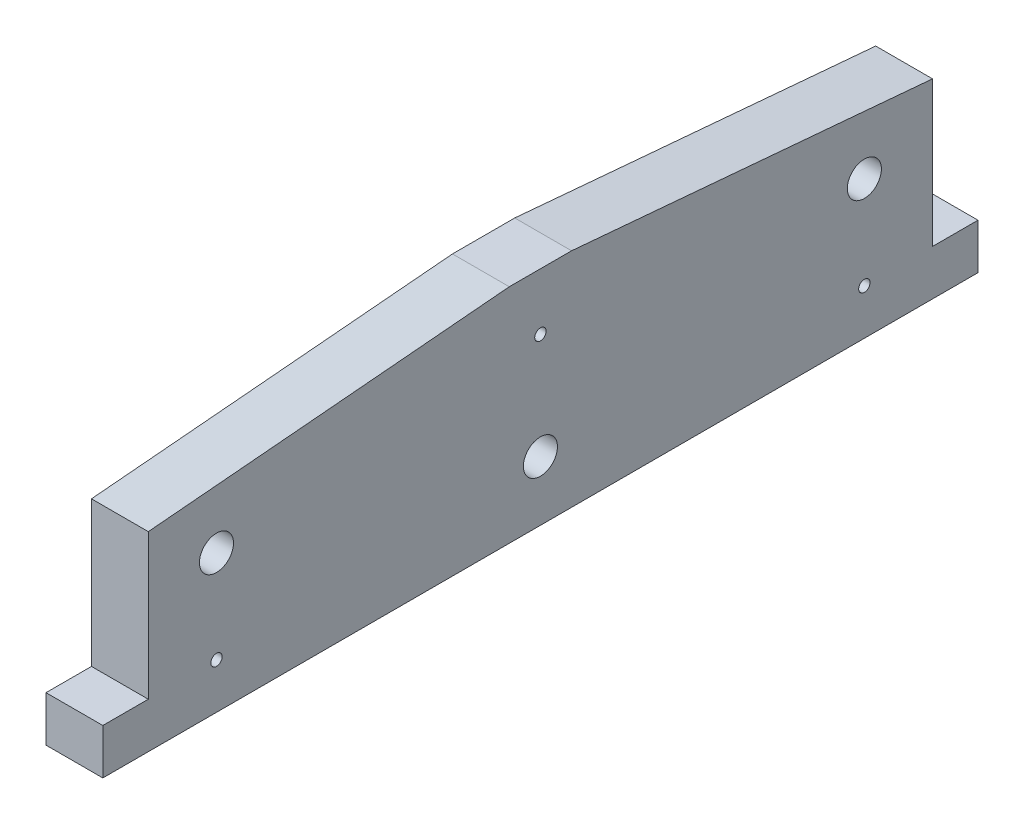
ISO-10303-21;
HEADER;
FILE_DESCRIPTION(('STEP AP214'),'2;1');
FILE_NAME('part.step','',(''),(''),'','','');
FILE_SCHEMA(('AUTOMOTIVE_DESIGN { 1 0 10303 214 1 1 1 1 }'));
ENDSEC;
DATA;
#1=APPLICATION_CONTEXT('core data for automotive mechanical design processes');
#2=APPLICATION_PROTOCOL_DEFINITION('international standard','automotive_design',2000,#1);
#3=PRODUCT_CONTEXT('',#1,'mechanical');
#4=PRODUCT('Part','Part','',(#3));
#5=PRODUCT_RELATED_PRODUCT_CATEGORY('part','',(#4));
#6=PRODUCT_DEFINITION_FORMATION('','',#4);
#7=PRODUCT_DEFINITION_CONTEXT('part definition',#1,'design');
#8=PRODUCT_DEFINITION('design','',#6,#7);
#9=PRODUCT_DEFINITION_SHAPE('','',#8);
#10=(LENGTH_UNIT() NAMED_UNIT(*) SI_UNIT(.MILLI.,.METRE.));
#11=(NAMED_UNIT(*) PLANE_ANGLE_UNIT() SI_UNIT($,.RADIAN.));
#12=(NAMED_UNIT(*) SI_UNIT($,.STERADIAN.) SOLID_ANGLE_UNIT());
#13=UNCERTAINTY_MEASURE_WITH_UNIT(LENGTH_MEASURE(1.E-05),#10,'distance_accuracy_value','');
#14=(GEOMETRIC_REPRESENTATION_CONTEXT(3) GLOBAL_UNCERTAINTY_ASSIGNED_CONTEXT((#13)) GLOBAL_UNIT_ASSIGNED_CONTEXT((#10,
#11,#12)) REPRESENTATION_CONTEXT('',''));
#15=CARTESIAN_POINT('',(0.,0.,0.));
#16=DIRECTION('',(0.,0.,1.));
#17=DIRECTION('',(1.,0.,0.));
#18=AXIS2_PLACEMENT_3D('',#15,#16,#17);
#19=CARTESIAN_POINT('',(10.,-3.94802521709064,-69.5));
#20=DIRECTION('',(0.,0.,1.));
#21=DIRECTION('',(1.,0.,0.));
#22=AXIS2_PLACEMENT_3D('',#19,#20,#21);
#23=PLANE('',#22);
#24=DIRECTION('',(0.,1.,0.));
#25=VECTOR('',#24,1.);
#26=CARTESIAN_POINT('',(0.,-3.94802521709064,-69.5));
#27=LINE('',#26,#25);
#28=CARTESIAN_POINT('',(0.,-29.4898596344228,-69.5));
#29=VERTEX_POINT('',#28);
#30=CARTESIAN_POINT('',(0.,-3.94802521709064,-69.5));
#31=VERTEX_POINT('',#30);
#32=EDGE_CURVE('E143',#29,#31,#27,.T.);
#33=ORIENTED_EDGE('',*,*,#32,.T.);
#34=DIRECTION('',(-1.,0.,0.));
#35=VECTOR('',#34,1.);
#36=CARTESIAN_POINT('',(10.,-3.94802521709064,-69.5));
#37=LINE('',#36,#35);
#38=CARTESIAN_POINT('',(10.,-3.94802521709064,-69.5));
#39=VERTEX_POINT('',#38);
#40=EDGE_CURVE('E11',#39,#31,#37,.T.);
#41=ORIENTED_EDGE('',*,*,#40,.F.);
#42=DIRECTION('',(0.,1.,0.));
#43=VECTOR('',#42,1.);
#44=CARTESIAN_POINT('',(10.,-3.94802521709064,-69.5));
#45=LINE('',#44,#43);
#46=CARTESIAN_POINT('',(10.,-29.4898596344228,-69.5));
#47=VERTEX_POINT('',#46);
#48=EDGE_CURVE('E163',#47,#39,#45,.T.);
#49=ORIENTED_EDGE('',*,*,#48,.F.);
#50=DIRECTION('',(-1.,0.,0.));
#51=VECTOR('',#50,1.);
#52=CARTESIAN_POINT('',(10.,-29.4898596344228,-69.5));
#53=LINE('',#52,#51);
#54=EDGE_CURVE('E139',#47,#29,#53,.T.);
#55=ORIENTED_EDGE('',*,*,#54,.T.);
#56=EDGE_LOOP('',(#33,#41,#49,#55));
#57=FACE_BOUND('',#56,.T.);
#58=ADVANCED_FACE('F35',(#57),#23,.F.);
#59=CARTESIAN_POINT('',(10.,1.60941483557722,-5.97816952854575));
#60=DIRECTION('',(0.,-0.996194698091746,0.0871557427476582));
#61=DIRECTION('',(0.,-0.0871557427476582,-0.996194698091746));
#62=AXIS2_PLACEMENT_3D('',#59,#60,#61);
#63=PLANE('',#62);
#64=DIRECTION('',(0.,0.0871557427476582,0.996194698091745));
#65=VECTOR('',#64,1.);
#66=CARTESIAN_POINT('',(0.,1.60941483557722,-5.97816952854575));
#67=LINE('',#66,#65);
#68=CARTESIAN_POINT('',(0.,1.60941483557722,-5.97816952854575));
#69=VERTEX_POINT('',#68);
#70=EDGE_CURVE('E146',#31,#69,#67,.T.);
#71=ORIENTED_EDGE('',*,*,#70,.T.);
#72=DIRECTION('',(-1.,0.,0.));
#73=VECTOR('',#72,1.);
#74=CARTESIAN_POINT('',(10.,1.60941483557722,-5.97816952854575));
#75=LINE('',#74,#73);
#76=CARTESIAN_POINT('',(10.,1.60941483557722,-5.97816952854575));
#77=VERTEX_POINT('',#76);
#78=EDGE_CURVE('E43',#77,#69,#75,.T.);
#79=ORIENTED_EDGE('',*,*,#78,.F.);
#80=DIRECTION('',(0.,0.0871557427476582,0.996194698091745));
#81=VECTOR('',#80,1.);
#82=CARTESIAN_POINT('',(10.,1.60941483557722,-5.97816952854575));
#83=LINE('',#82,#81);
#84=EDGE_CURVE('E100',#39,#77,#83,.T.);
#85=ORIENTED_EDGE('',*,*,#84,.F.);
#86=ORIENTED_EDGE('',*,*,#40,.T.);
#87=EDGE_LOOP('',(#71,#79,#85,#86));
#88=FACE_BOUND('',#87,.T.);
#89=ADVANCED_FACE('F184',(#88),#63,.F.);
#90=CARTESIAN_POINT('',(10.,1.60941483557722,4.97816952854575));
#91=DIRECTION('',(0.,-1.,0.));
#92=DIRECTION('',(0.,0.,-1.));
#93=AXIS2_PLACEMENT_3D('',#90,#91,#92);
#94=PLANE('',#93);
#95=DIRECTION('',(0.,0.,1.));
#96=VECTOR('',#95,1.);
#97=CARTESIAN_POINT('',(0.,1.60941483557722,4.97816952854575));
#98=LINE('',#97,#96);
#99=CARTESIAN_POINT('',(0.,1.60941483557722,4.97816952854575));
#100=VERTEX_POINT('',#99);
#101=EDGE_CURVE('E150',#69,#100,#98,.T.);
#102=ORIENTED_EDGE('',*,*,#101,.T.);
#103=DIRECTION('',(-1.,0.,0.));
#104=VECTOR('',#103,1.);
#105=CARTESIAN_POINT('',(10.,1.60941483557722,4.97816952854575));
#106=LINE('',#105,#104);
#107=CARTESIAN_POINT('',(10.,1.60941483557722,4.97816952854575));
#108=VERTEX_POINT('',#107);
#109=EDGE_CURVE('E176',#108,#100,#106,.T.);
#110=ORIENTED_EDGE('',*,*,#109,.F.);
#111=DIRECTION('',(0.,0.,1.));
#112=VECTOR('',#111,1.);
#113=CARTESIAN_POINT('',(10.,1.60941483557722,-5.97816952854575));
#114=LINE('',#113,#112);
#115=EDGE_CURVE('E183',#77,#108,#114,.T.);
#116=ORIENTED_EDGE('',*,*,#115,.F.);
#117=ORIENTED_EDGE('',*,*,#78,.T.);
#118=EDGE_LOOP('',(#102,#110,#116,#117));
#119=FACE_BOUND('',#118,.T.);
#120=ADVANCED_FACE('F181',(#119),#94,.F.);
#121=CARTESIAN_POINT('',(10.,1.60941483557722,4.97816952854575));
#122=DIRECTION('',(0.,-0.996194698091746,-0.0871557427476585));
#123=DIRECTION('',(0.,0.0871557427476585,-0.996194698091746));
#124=AXIS2_PLACEMENT_3D('',#121,#122,#123);
#125=PLANE('',#124);
#126=DIRECTION('',(0.,-0.0871557427476584,0.996194698091745));
#127=VECTOR('',#126,1.);
#128=CARTESIAN_POINT('',(0.,1.60941483557722,4.97816952854575));
#129=LINE('',#128,#127);
#130=CARTESIAN_POINT('',(0.,-3.94802521709065,68.5));
#131=VERTEX_POINT('',#130);
#132=EDGE_CURVE('E152',#100,#131,#129,.T.);
#133=ORIENTED_EDGE('',*,*,#132,.T.);
#134=DIRECTION('',(-1.,0.,0.));
#135=VECTOR('',#134,1.);
#136=CARTESIAN_POINT('',(10.,-3.94802521709065,68.5));
#137=LINE('',#136,#135);
#138=CARTESIAN_POINT('',(10.,-3.94802521709065,68.5));
#139=VERTEX_POINT('',#138);
#140=EDGE_CURVE('E173',#139,#131,#137,.T.);
#141=ORIENTED_EDGE('',*,*,#140,.F.);
#142=DIRECTION('',(0.,-0.0871557427476584,0.996194698091745));
#143=VECTOR('',#142,1.);
#144=CARTESIAN_POINT('',(10.,1.60941483557722,4.97816952854575));
#145=LINE('',#144,#143);
#146=EDGE_CURVE('E203',#108,#139,#145,.T.);
#147=ORIENTED_EDGE('',*,*,#146,.F.);
#148=ORIENTED_EDGE('',*,*,#109,.T.);
#149=EDGE_LOOP('',(#133,#141,#147,#148));
#150=FACE_BOUND('',#149,.T.);
#151=ADVANCED_FACE('F194',(#150),#125,.F.);
#152=CARTESIAN_POINT('',(10.,-3.94802521709065,68.5));
#153=DIRECTION('',(0.,0.,-1.));
#154=DIRECTION('',(-1.,0.,0.));
#155=AXIS2_PLACEMENT_3D('',#152,#153,#154);
#156=PLANE('',#155);
#157=DIRECTION('',(0.,-1.,0.));
#158=VECTOR('',#157,1.);
#159=CARTESIAN_POINT('',(0.,-3.94802521709065,68.5));
#160=LINE('',#159,#158);
#161=CARTESIAN_POINT('',(0.,-29.4898596344228,68.5));
#162=VERTEX_POINT('',#161);
#163=EDGE_CURVE('E154',#131,#162,#160,.T.);
#164=ORIENTED_EDGE('',*,*,#163,.T.);
#165=DIRECTION('',(-1.,0.,0.));
#166=VECTOR('',#165,1.);
#167=CARTESIAN_POINT('',(10.,-29.4898596344228,68.5));
#168=LINE('',#167,#166);
#169=CARTESIAN_POINT('',(10.,-29.4898596344228,68.5));
#170=VERTEX_POINT('',#169);
#171=EDGE_CURVE('E170',#170,#162,#168,.T.);
#172=ORIENTED_EDGE('',*,*,#171,.F.);
#173=DIRECTION('',(0.,-1.,0.));
#174=VECTOR('',#173,1.);
#175=CARTESIAN_POINT('',(10.,-3.94802521709065,68.5));
#176=LINE('',#175,#174);
#177=EDGE_CURVE('E200',#139,#170,#176,.T.);
#178=ORIENTED_EDGE('',*,*,#177,.F.);
#179=ORIENTED_EDGE('',*,*,#140,.T.);
#180=EDGE_LOOP('',(#164,#172,#178,#179));
#181=FACE_BOUND('',#180,.T.);
#182=ADVANCED_FACE('F198',(#181),#156,.F.);
#183=CARTESIAN_POINT('',(10.,-29.4898596344228,76.5));
#184=DIRECTION('',(0.,-1.,0.));
#185=DIRECTION('',(0.,0.,-1.));
#186=AXIS2_PLACEMENT_3D('',#183,#184,#185);
#187=PLANE('',#186);
#188=DIRECTION('',(0.,0.,1.));
#189=VECTOR('',#188,1.);
#190=CARTESIAN_POINT('',(0.,-29.4898596344228,76.5));
#191=LINE('',#190,#189);
#192=CARTESIAN_POINT('',(0.,-29.4898596344228,76.5));
#193=VERTEX_POINT('',#192);
#194=EDGE_CURVE('E156',#162,#193,#191,.T.);
#195=ORIENTED_EDGE('',*,*,#194,.T.);
#196=DIRECTION('',(-1.,0.,0.));
#197=VECTOR('',#196,1.);
#198=CARTESIAN_POINT('',(10.,-29.4898596344228,76.5));
#199=LINE('',#198,#197);
#200=CARTESIAN_POINT('',(10.,-29.4898596344228,76.5));
#201=VERTEX_POINT('',#200);
#202=EDGE_CURVE('E167',#201,#193,#199,.T.);
#203=ORIENTED_EDGE('',*,*,#202,.F.);
#204=DIRECTION('',(0.,0.,1.));
#205=VECTOR('',#204,1.);
#206=CARTESIAN_POINT('',(10.,-29.4898596344228,76.5));
#207=LINE('',#206,#205);
#208=EDGE_CURVE('E202',#170,#201,#207,.T.);
#209=ORIENTED_EDGE('',*,*,#208,.F.);
#210=ORIENTED_EDGE('',*,*,#171,.T.);
#211=EDGE_LOOP('',(#195,#203,#209,#210));
#212=FACE_BOUND('',#211,.T.);
#213=ADVANCED_FACE('F295',(#212),#187,.F.);
#214=CARTESIAN_POINT('',(10.,-37.4898596344228,76.5));
#215=DIRECTION('',(0.,0.,-1.));
#216=DIRECTION('',(-1.,0.,0.));
#217=AXIS2_PLACEMENT_3D('',#214,#215,#216);
#218=PLANE('',#217);
#219=DIRECTION('',(0.,-1.,0.));
#220=VECTOR('',#219,1.);
#221=CARTESIAN_POINT('',(0.,-37.4898596344228,76.5));
#222=LINE('',#221,#220);
#223=CARTESIAN_POINT('',(0.,-37.4898596344228,76.5));
#224=VERTEX_POINT('',#223);
#225=EDGE_CURVE('E158',#193,#224,#222,.T.);
#226=ORIENTED_EDGE('',*,*,#225,.T.);
#227=DIRECTION('',(-1.,0.,0.));
#228=VECTOR('',#227,1.);
#229=CARTESIAN_POINT('',(10.,-37.4898596344228,76.5));
#230=LINE('',#229,#228);
#231=CARTESIAN_POINT('',(10.,-37.4898596344228,76.5));
#232=VERTEX_POINT('',#231);
#233=EDGE_CURVE('E134',#232,#224,#230,.T.);
#234=ORIENTED_EDGE('',*,*,#233,.F.);
#235=DIRECTION('',(0.,-1.,0.));
#236=VECTOR('',#235,1.);
#237=CARTESIAN_POINT('',(10.,-37.4898596344228,76.5));
#238=LINE('',#237,#236);
#239=EDGE_CURVE('E125',#201,#232,#238,.T.);
#240=ORIENTED_EDGE('',*,*,#239,.F.);
#241=ORIENTED_EDGE('',*,*,#202,.T.);
#242=EDGE_LOOP('',(#226,#234,#240,#241));
#243=FACE_BOUND('',#242,.T.);
#244=ADVANCED_FACE('F292',(#243),#218,.F.);
#245=CARTESIAN_POINT('',(10.,-37.4898596344227,-77.5));
#246=DIRECTION('',(0.,1.,0.));
#247=DIRECTION('',(0.,0.,1.));
#248=AXIS2_PLACEMENT_3D('',#245,#246,#247);
#249=PLANE('',#248);
#250=DIRECTION('',(0.,0.,-1.));
#251=VECTOR('',#250,1.);
#252=CARTESIAN_POINT('',(0.,-37.4898596344227,-77.5));
#253=LINE('',#252,#251);
#254=CARTESIAN_POINT('',(0.,-37.4898596344227,-77.5));
#255=VERTEX_POINT('',#254);
#256=EDGE_CURVE('E133',#224,#255,#253,.T.);
#257=ORIENTED_EDGE('',*,*,#256,.T.);
#258=DIRECTION('',(-1.,0.,0.));
#259=VECTOR('',#258,1.);
#260=CARTESIAN_POINT('',(10.,-37.4898596344227,-77.5));
#261=LINE('',#260,#259);
#262=CARTESIAN_POINT('',(10.,-37.4898596344227,-77.5));
#263=VERTEX_POINT('',#262);
#264=EDGE_CURVE('E130',#263,#255,#261,.T.);
#265=ORIENTED_EDGE('',*,*,#264,.F.);
#266=DIRECTION('',(0.,0.,-1.));
#267=VECTOR('',#266,1.);
#268=CARTESIAN_POINT('',(10.,-37.4898596344227,-77.5));
#269=LINE('',#268,#267);
#270=EDGE_CURVE('E119',#232,#263,#269,.T.);
#271=ORIENTED_EDGE('',*,*,#270,.F.);
#272=ORIENTED_EDGE('',*,*,#233,.T.);
#273=EDGE_LOOP('',(#257,#265,#271,#272));
#274=FACE_BOUND('',#273,.T.);
#275=ADVANCED_FACE('F131',(#274),#249,.F.);
#276=CARTESIAN_POINT('',(10.,-37.4898596344227,-77.5));
#277=DIRECTION('',(0.,0.,1.));
#278=DIRECTION('',(1.,0.,0.));
#279=AXIS2_PLACEMENT_3D('',#276,#277,#278);
#280=PLANE('',#279);
#281=DIRECTION('',(0.,1.,0.));
#282=VECTOR('',#281,1.);
#283=CARTESIAN_POINT('',(0.,-37.4898596344227,-77.5));
#284=LINE('',#283,#282);
#285=CARTESIAN_POINT('',(0.,-29.4898596344228,-77.5));
#286=VERTEX_POINT('',#285);
#287=EDGE_CURVE('E86',#255,#286,#284,.T.);
#288=ORIENTED_EDGE('',*,*,#287,.T.);
#289=DIRECTION('',(-1.,0.,0.));
#290=VECTOR('',#289,1.);
#291=CARTESIAN_POINT('',(10.,-29.4898596344228,-77.5));
#292=LINE('',#291,#290);
#293=CARTESIAN_POINT('',(10.,-29.4898596344228,-77.5));
#294=VERTEX_POINT('',#293);
#295=EDGE_CURVE('E135',#294,#286,#292,.T.);
#296=ORIENTED_EDGE('',*,*,#295,.F.);
#297=DIRECTION('',(0.,1.,0.));
#298=VECTOR('',#297,1.);
#299=CARTESIAN_POINT('',(10.,-37.4898596344227,-77.5));
#300=LINE('',#299,#298);
#301=EDGE_CURVE('E123',#263,#294,#300,.T.);
#302=ORIENTED_EDGE('',*,*,#301,.F.);
#303=ORIENTED_EDGE('',*,*,#264,.T.);
#304=EDGE_LOOP('',(#288,#296,#302,#303));
#305=FACE_BOUND('',#304,.T.);
#306=ADVANCED_FACE('F137',(#305),#280,.F.);
#307=CARTESIAN_POINT('',(10.,-29.4898596344228,-69.5));
#308=DIRECTION('',(0.,-1.,0.));
#309=DIRECTION('',(0.,0.,-1.));
#310=AXIS2_PLACEMENT_3D('',#307,#308,#309);
#311=PLANE('',#310);
#312=DIRECTION('',(0.,0.,1.));
#313=VECTOR('',#312,1.);
#314=CARTESIAN_POINT('',(0.,-29.4898596344228,-69.5));
#315=LINE('',#314,#313);
#316=EDGE_CURVE('E92',#286,#29,#315,.T.);
#317=ORIENTED_EDGE('',*,*,#316,.T.);
#318=ORIENTED_EDGE('',*,*,#54,.F.);
#319=DIRECTION('',(0.,0.,1.));
#320=VECTOR('',#319,1.);
#321=CARTESIAN_POINT('',(10.,-29.4898596344228,-69.5));
#322=LINE('',#321,#320);
#323=EDGE_CURVE('E51',#294,#47,#322,.T.);
#324=ORIENTED_EDGE('',*,*,#323,.F.);
#325=ORIENTED_EDGE('',*,*,#295,.T.);
#326=EDGE_LOOP('',(#317,#318,#324,#325));
#327=FACE_BOUND('',#326,.T.);
#328=ADVANCED_FACE('F258',(#327),#311,.F.);
#329=CARTESIAN_POINT('',(10.,0.,0.));
#330=DIRECTION('',(1.,0.,0.));
#331=DIRECTION('',(0.,0.,-1.));
#332=AXIS2_PLACEMENT_3D('',#329,#330,#331);
#333=PLANE('',#332);
#334=CARTESIAN_POINT('',(10.,-29.4898596344227,56.5));
#335=DIRECTION('',(1.,0.,0.));
#336=DIRECTION('',(0.,0.,-1.));
#337=AXIS2_PLACEMENT_3D('',#334,#335,#336);
#338=CIRCLE('',#337,1.00000000000001);
#339=CARTESIAN_POINT('',(10.,-29.4898596344227,55.5));
#340=VERTEX_POINT('',#339);
#341=EDGE_CURVE('E241',#340,#340,#338,.T.);
#342=ORIENTED_EDGE('',*,*,#341,.F.);
#343=EDGE_LOOP('',(#342));
#344=FACE_BOUND('',#343,.T.);
#345=CARTESIAN_POINT('',(10.,-13.1787704011176,56.5));
#346=DIRECTION('',(1.,0.,0.));
#347=DIRECTION('',(0.,0.,-1.));
#348=AXIS2_PLACEMENT_3D('',#345,#346,#347);
#349=CIRCLE('',#348,3.);
#350=CARTESIAN_POINT('',(10.,-13.1787704011176,53.5));
#351=VERTEX_POINT('',#350);
#352=EDGE_CURVE('E235',#351,#351,#349,.T.);
#353=ORIENTED_EDGE('',*,*,#352,.F.);
#354=EDGE_LOOP('',(#353));
#355=FACE_BOUND('',#354,.T.);
#356=CARTESIAN_POINT('',(10.,-29.4898596344227,-57.5));
#357=DIRECTION('',(1.,0.,0.));
#358=DIRECTION('',(0.,0.,-1.));
#359=AXIS2_PLACEMENT_3D('',#356,#357,#358);
#360=CIRCLE('',#359,1.00000000000001);
#361=CARTESIAN_POINT('',(10.,-29.4898596344227,-58.5));
#362=VERTEX_POINT('',#361);
#363=EDGE_CURVE('E229',#362,#362,#360,.T.);
#364=ORIENTED_EDGE('',*,*,#363,.F.);
#365=EDGE_LOOP('',(#364));
#366=FACE_BOUND('',#365,.T.);
#367=CARTESIAN_POINT('',(10.,-13.1787704011176,-57.5));
#368=DIRECTION('',(1.,0.,0.));
#369=DIRECTION('',(0.,0.,-1.));
#370=AXIS2_PLACEMENT_3D('',#367,#368,#369);
#371=CIRCLE('',#370,3.);
#372=CARTESIAN_POINT('',(10.,-13.1787704011176,-60.5));
#373=VERTEX_POINT('',#372);
#374=EDGE_CURVE('E223',#373,#373,#371,.T.);
#375=ORIENTED_EDGE('',*,*,#374,.F.);
#376=EDGE_LOOP('',(#375));
#377=FACE_BOUND('',#376,.T.);
#378=CARTESIAN_POINT('',(10.,-27.0028433553595,-0.5));
#379=DIRECTION('',(1.,0.,0.));
#380=DIRECTION('',(0.,0.,-1.));
#381=AXIS2_PLACEMENT_3D('',#378,#379,#380);
#382=CIRCLE('',#381,3.);
#383=CARTESIAN_POINT('',(10.,-27.0028433553595,-3.5));
#384=VERTEX_POINT('',#383);
#385=EDGE_CURVE('E217',#384,#384,#382,.T.);
#386=ORIENTED_EDGE('',*,*,#385,.F.);
#387=EDGE_LOOP('',(#386));
#388=FACE_BOUND('',#387,.T.);
#389=CARTESIAN_POINT('',(10.,-8.39058516876356,-0.499999999999999));
#390=DIRECTION('',(1.,0.,0.));
#391=DIRECTION('',(0.,0.,-1.));
#392=AXIS2_PLACEMENT_3D('',#389,#390,#391);
#393=CIRCLE('',#392,1.);
#394=CARTESIAN_POINT('',(10.,-8.39058516876356,-1.5));
#395=VERTEX_POINT('',#394);
#396=EDGE_CURVE('E211',#395,#395,#393,.T.);
#397=ORIENTED_EDGE('',*,*,#396,.F.);
#398=EDGE_LOOP('',(#397));
#399=FACE_BOUND('',#398,.T.);
#400=ORIENTED_EDGE('',*,*,#48,.T.);
#401=ORIENTED_EDGE('',*,*,#84,.T.);
#402=ORIENTED_EDGE('',*,*,#115,.T.);
#403=ORIENTED_EDGE('',*,*,#146,.T.);
#404=ORIENTED_EDGE('',*,*,#177,.T.);
#405=ORIENTED_EDGE('',*,*,#208,.T.);
#406=ORIENTED_EDGE('',*,*,#239,.T.);
#407=ORIENTED_EDGE('',*,*,#270,.T.);
#408=ORIENTED_EDGE('',*,*,#301,.T.);
#409=ORIENTED_EDGE('',*,*,#323,.T.);
#410=EDGE_LOOP('',(#400,#401,#402,#403,#404,#405,#406,#407,#408,#409));
#411=FACE_BOUND('',#410,.T.);
#412=ADVANCED_FACE('F121',(#344,#355,#366,#377,#388,#399,#411),#333,.T.);
#413=CARTESIAN_POINT('',(0.,0.,0.));
#414=DIRECTION('',(1.,0.,0.));
#415=DIRECTION('',(0.,0.,-1.));
#416=AXIS2_PLACEMENT_3D('',#413,#414,#415);
#417=PLANE('',#416);
#418=CARTESIAN_POINT('',(0.,-29.4898596344227,56.5));
#419=DIRECTION('',(1.,0.,0.));
#420=DIRECTION('',(0.,0.,-1.));
#421=AXIS2_PLACEMENT_3D('',#418,#419,#420);
#422=CIRCLE('',#421,1.00000000000001);
#423=CARTESIAN_POINT('',(0.,-29.4898596344227,55.5));
#424=VERTEX_POINT('',#423);
#425=EDGE_CURVE('E238',#424,#424,#422,.T.);
#426=ORIENTED_EDGE('',*,*,#425,.T.);
#427=EDGE_LOOP('',(#426));
#428=FACE_BOUND('',#427,.T.);
#429=CARTESIAN_POINT('',(0.,-13.1787704011176,56.5));
#430=DIRECTION('',(1.,0.,0.));
#431=DIRECTION('',(0.,0.,-1.));
#432=AXIS2_PLACEMENT_3D('',#429,#430,#431);
#433=CIRCLE('',#432,3.);
#434=CARTESIAN_POINT('',(0.,-13.1787704011176,53.5));
#435=VERTEX_POINT('',#434);
#436=EDGE_CURVE('E232',#435,#435,#433,.T.);
#437=ORIENTED_EDGE('',*,*,#436,.T.);
#438=EDGE_LOOP('',(#437));
#439=FACE_BOUND('',#438,.T.);
#440=CARTESIAN_POINT('',(0.,-29.4898596344227,-57.5));
#441=DIRECTION('',(1.,0.,0.));
#442=DIRECTION('',(0.,0.,-1.));
#443=AXIS2_PLACEMENT_3D('',#440,#441,#442);
#444=CIRCLE('',#443,1.00000000000001);
#445=CARTESIAN_POINT('',(0.,-29.4898596344227,-58.5));
#446=VERTEX_POINT('',#445);
#447=EDGE_CURVE('E226',#446,#446,#444,.T.);
#448=ORIENTED_EDGE('',*,*,#447,.T.);
#449=EDGE_LOOP('',(#448));
#450=FACE_BOUND('',#449,.T.);
#451=CARTESIAN_POINT('',(0.,-13.1787704011176,-57.5));
#452=DIRECTION('',(1.,0.,0.));
#453=DIRECTION('',(0.,0.,-1.));
#454=AXIS2_PLACEMENT_3D('',#451,#452,#453);
#455=CIRCLE('',#454,3.);
#456=CARTESIAN_POINT('',(0.,-13.1787704011176,-60.5));
#457=VERTEX_POINT('',#456);
#458=EDGE_CURVE('E220',#457,#457,#455,.T.);
#459=ORIENTED_EDGE('',*,*,#458,.T.);
#460=EDGE_LOOP('',(#459));
#461=FACE_BOUND('',#460,.T.);
#462=CARTESIAN_POINT('',(0.,-27.0028433553595,-0.5));
#463=DIRECTION('',(1.,0.,0.));
#464=DIRECTION('',(0.,0.,-1.));
#465=AXIS2_PLACEMENT_3D('',#462,#463,#464);
#466=CIRCLE('',#465,3.);
#467=CARTESIAN_POINT('',(0.,-27.0028433553595,-3.5));
#468=VERTEX_POINT('',#467);
#469=EDGE_CURVE('E214',#468,#468,#466,.T.);
#470=ORIENTED_EDGE('',*,*,#469,.T.);
#471=EDGE_LOOP('',(#470));
#472=FACE_BOUND('',#471,.T.);
#473=CARTESIAN_POINT('',(0.,-8.39058516876356,-0.499999999999999));
#474=DIRECTION('',(1.,0.,0.));
#475=DIRECTION('',(0.,0.,-1.));
#476=AXIS2_PLACEMENT_3D('',#473,#474,#475);
#477=CIRCLE('',#476,1.);
#478=CARTESIAN_POINT('',(0.,-8.39058516876356,-1.5));
#479=VERTEX_POINT('',#478);
#480=EDGE_CURVE('E147',#479,#479,#477,.T.);
#481=ORIENTED_EDGE('',*,*,#480,.T.);
#482=EDGE_LOOP('',(#481));
#483=FACE_BOUND('',#482,.T.);
#484=ORIENTED_EDGE('',*,*,#32,.F.);
#485=ORIENTED_EDGE('',*,*,#316,.F.);
#486=ORIENTED_EDGE('',*,*,#287,.F.);
#487=ORIENTED_EDGE('',*,*,#256,.F.);
#488=ORIENTED_EDGE('',*,*,#225,.F.);
#489=ORIENTED_EDGE('',*,*,#194,.F.);
#490=ORIENTED_EDGE('',*,*,#163,.F.);
#491=ORIENTED_EDGE('',*,*,#132,.F.);
#492=ORIENTED_EDGE('',*,*,#101,.F.);
#493=ORIENTED_EDGE('',*,*,#70,.F.);
#494=EDGE_LOOP('',(#484,#485,#486,#487,#488,#489,#490,#491,#492,#493));
#495=FACE_BOUND('',#494,.T.);
#496=ADVANCED_FACE('F188',(#428,#439,#450,#461,#472,#483,#495),#417,.F.);
#497=CARTESIAN_POINT('',(0.,-8.39058516876356,-0.499999999999999));
#498=DIRECTION('',(1.,0.,0.));
#499=DIRECTION('',(0.,0.,-1.));
#500=AXIS2_PLACEMENT_3D('',#497,#498,#499);
#501=CYLINDRICAL_SURFACE('',#500,1.);
#502=ORIENTED_EDGE('',*,*,#480,.F.);
#503=EDGE_LOOP('',(#502));
#504=FACE_BOUND('',#503,.T.);
#505=ORIENTED_EDGE('',*,*,#396,.T.);
#506=EDGE_LOOP('',(#505));
#507=FACE_BOUND('',#506,.T.);
#508=ADVANCED_FACE('F270',(#504,#507),#501,.F.);
#509=CARTESIAN_POINT('',(0.,-27.0028433553595,-0.5));
#510=DIRECTION('',(1.,0.,0.));
#511=DIRECTION('',(0.,0.,-1.));
#512=AXIS2_PLACEMENT_3D('',#509,#510,#511);
#513=CYLINDRICAL_SURFACE('',#512,3.);
#514=ORIENTED_EDGE('',*,*,#469,.F.);
#515=EDGE_LOOP('',(#514));
#516=FACE_BOUND('',#515,.T.);
#517=ORIENTED_EDGE('',*,*,#385,.T.);
#518=EDGE_LOOP('',(#517));
#519=FACE_BOUND('',#518,.T.);
#520=ADVANCED_FACE('F272',(#516,#519),#513,.F.);
#521=CARTESIAN_POINT('',(0.,-13.1787704011176,-57.5));
#522=DIRECTION('',(1.,0.,0.));
#523=DIRECTION('',(0.,0.,-1.));
#524=AXIS2_PLACEMENT_3D('',#521,#522,#523);
#525=CYLINDRICAL_SURFACE('',#524,3.);
#526=ORIENTED_EDGE('',*,*,#458,.F.);
#527=EDGE_LOOP('',(#526));
#528=FACE_BOUND('',#527,.T.);
#529=ORIENTED_EDGE('',*,*,#374,.T.);
#530=EDGE_LOOP('',(#529));
#531=FACE_BOUND('',#530,.T.);
#532=ADVANCED_FACE('F279',(#528,#531),#525,.F.);
#533=CARTESIAN_POINT('',(0.,-29.4898596344227,-57.5));
#534=DIRECTION('',(1.,0.,0.));
#535=DIRECTION('',(0.,0.,-1.));
#536=AXIS2_PLACEMENT_3D('',#533,#534,#535);
#537=CYLINDRICAL_SURFACE('',#536,1.00000000000001);
#538=ORIENTED_EDGE('',*,*,#447,.F.);
#539=EDGE_LOOP('',(#538));
#540=FACE_BOUND('',#539,.T.);
#541=ORIENTED_EDGE('',*,*,#363,.T.);
#542=EDGE_LOOP('',(#541));
#543=FACE_BOUND('',#542,.T.);
#544=ADVANCED_FACE('F388',(#540,#543),#537,.F.);
#545=CARTESIAN_POINT('',(0.,-13.1787704011176,56.5));
#546=DIRECTION('',(1.,0.,0.));
#547=DIRECTION('',(0.,0.,-1.));
#548=AXIS2_PLACEMENT_3D('',#545,#546,#547);
#549=CYLINDRICAL_SURFACE('',#548,3.);
#550=ORIENTED_EDGE('',*,*,#436,.F.);
#551=EDGE_LOOP('',(#550));
#552=FACE_BOUND('',#551,.T.);
#553=ORIENTED_EDGE('',*,*,#352,.T.);
#554=EDGE_LOOP('',(#553));
#555=FACE_BOUND('',#554,.T.);
#556=ADVANCED_FACE('F252',(#552,#555),#549,.F.);
#557=CARTESIAN_POINT('',(0.,-29.4898596344227,56.5));
#558=DIRECTION('',(1.,0.,0.));
#559=DIRECTION('',(0.,0.,-1.));
#560=AXIS2_PLACEMENT_3D('',#557,#558,#559);
#561=CYLINDRICAL_SURFACE('',#560,1.00000000000001);
#562=ORIENTED_EDGE('',*,*,#425,.F.);
#563=EDGE_LOOP('',(#562));
#564=FACE_BOUND('',#563,.T.);
#565=ORIENTED_EDGE('',*,*,#341,.T.);
#566=EDGE_LOOP('',(#565));
#567=FACE_BOUND('',#566,.T.);
#568=ADVANCED_FACE('F249',(#564,#567),#561,.F.);
#569=CLOSED_SHELL('',(#58,#89,#120,#151,#182,#213,#244,#275,#306,#328,#412,#496,#508,#520,#532,
#544,#556,#568));
#570=MANIFOLD_SOLID_BREP('B2',#569);
#571=ADVANCED_BREP_SHAPE_REPRESENTATION('',(#18,#570),#14);
#572=SHAPE_DEFINITION_REPRESENTATION(#9,#571);
ENDSEC;
END-ISO-10303-21;
